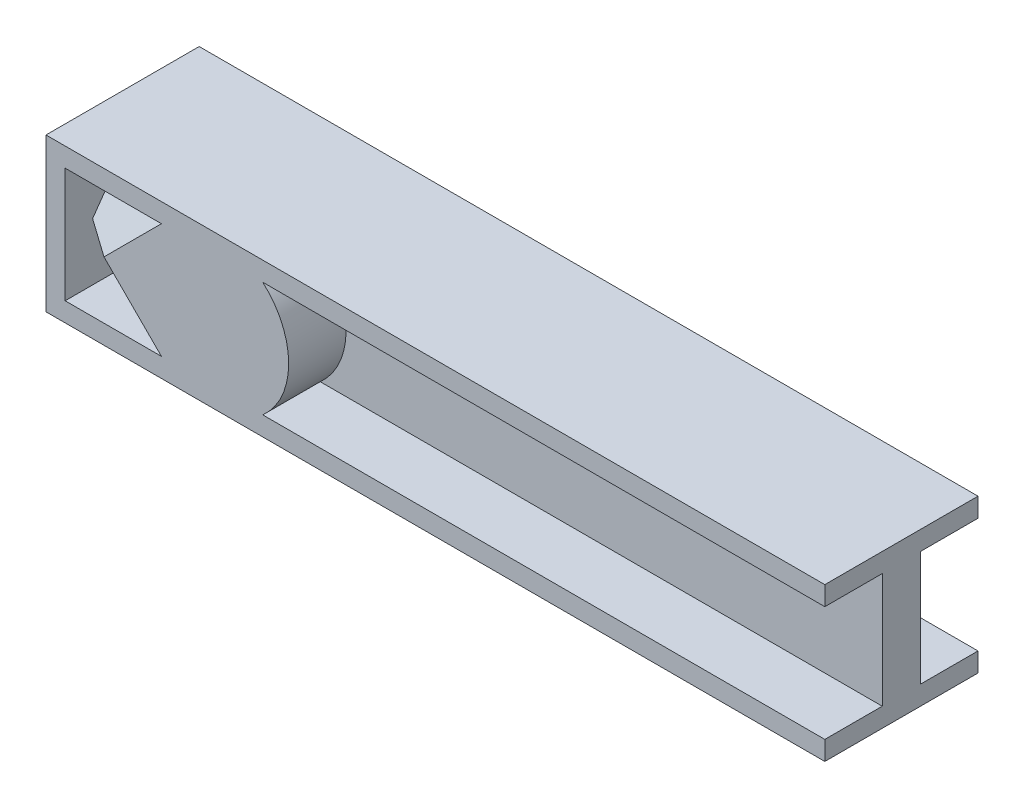
ISO-10303-21;
HEADER;
FILE_DESCRIPTION(('STEP AP214'),'2;1');
FILE_NAME('part.step','',(''),(''),'','','');
FILE_SCHEMA(('AUTOMOTIVE_DESIGN { 1 0 10303 214 1 1 1 1 }'));
ENDSEC;
DATA;
#1=APPLICATION_CONTEXT('core data for automotive mechanical design processes');
#2=APPLICATION_PROTOCOL_DEFINITION('international standard','automotive_design',2000,#1);
#3=PRODUCT_CONTEXT('',#1,'mechanical');
#4=PRODUCT('Part','Part','',(#3));
#5=PRODUCT_RELATED_PRODUCT_CATEGORY('part','',(#4));
#6=PRODUCT_DEFINITION_FORMATION('','',#4);
#7=PRODUCT_DEFINITION_CONTEXT('part definition',#1,'design');
#8=PRODUCT_DEFINITION('design','',#6,#7);
#9=PRODUCT_DEFINITION_SHAPE('','',#8);
#10=(LENGTH_UNIT() NAMED_UNIT(*) SI_UNIT(.MILLI.,.METRE.));
#11=(NAMED_UNIT(*) PLANE_ANGLE_UNIT() SI_UNIT($,.RADIAN.));
#12=(NAMED_UNIT(*) SI_UNIT($,.STERADIAN.) SOLID_ANGLE_UNIT());
#13=UNCERTAINTY_MEASURE_WITH_UNIT(LENGTH_MEASURE(1.E-05),#10,'distance_accuracy_value','');
#14=(GEOMETRIC_REPRESENTATION_CONTEXT(3) GLOBAL_UNCERTAINTY_ASSIGNED_CONTEXT((#13)) GLOBAL_UNIT_ASSIGNED_CONTEXT((#10,
#11,#12)) REPRESENTATION_CONTEXT('',''));
#15=CARTESIAN_POINT('',(0.,0.,0.));
#16=DIRECTION('',(0.,0.,1.));
#17=DIRECTION('',(1.,0.,0.));
#18=AXIS2_PLACEMENT_3D('',#15,#16,#17);
#19=CARTESIAN_POINT('',(0.,0.,2.5));
#20=DIRECTION('',(0.,0.,1.));
#21=DIRECTION('',(1.,0.,0.));
#22=AXIS2_PLACEMENT_3D('',#19,#20,#21);
#23=PLANE('',#22);
#24=DIRECTION('',(1.,0.,0.));
#25=VECTOR('',#24,1.);
#26=CARTESIAN_POINT('',(-59.1849756582735,-7.5,2.5));
#27=LINE('',#26,#25);
#28=CARTESIAN_POINT('',(-59.1849756582735,-7.5,2.5));
#29=VERTEX_POINT('',#28);
#30=CARTESIAN_POINT('',(-57.2209799954598,-7.5,2.5));
#31=VERTEX_POINT('',#30);
#32=EDGE_CURVE('E366',#29,#31,#27,.T.);
#33=ORIENTED_EDGE('',*,*,#32,.T.);
#34=DIRECTION('',(-0.70710678118654,0.707106781186555,0.));
#35=VECTOR('',#34,1.);
#36=CARTESIAN_POINT('',(-59.4176791365607,-5.303300858899,2.5));
#37=LINE('',#36,#35);
#38=CARTESIAN_POINT('',(-59.1849756582735,-5.53600433718624,2.5));
#39=VERTEX_POINT('',#38);
#40=EDGE_CURVE('E337',#31,#39,#37,.T.);
#41=ORIENTED_EDGE('',*,*,#40,.T.);
#42=DIRECTION('',(0.,-1.,0.));
#43=VECTOR('',#42,1.);
#44=CARTESIAN_POINT('',(-59.1849756582735,7.5,2.5));
#45=LINE('',#44,#43);
#46=EDGE_CURVE('E367',#39,#29,#45,.T.);
#47=ORIENTED_EDGE('',*,*,#46,.T.);
#48=EDGE_LOOP('',(#33,#41,#47));
#49=FACE_BOUND('',#48,.T.);
#50=ADVANCED_FACE('F35',(#49),#23,.T.);
#51=CARTESIAN_POINT('',(0.,0.,-2.5));
#52=DIRECTION('',(0.,0.,1.));
#53=DIRECTION('',(1.,0.,0.));
#54=AXIS2_PLACEMENT_3D('',#51,#52,#53);
#55=PLANE('',#54);
#56=DIRECTION('',(0.,-1.,0.));
#57=VECTOR('',#56,1.);
#58=CARTESIAN_POINT('',(-59.1849756582735,7.5,-2.5));
#59=LINE('',#58,#57);
#60=CARTESIAN_POINT('',(-59.1849756582735,-5.53600433718614,-2.5));
#61=VERTEX_POINT('',#60);
#62=CARTESIAN_POINT('',(-59.1849756582735,-7.5,-2.5));
#63=VERTEX_POINT('',#62);
#64=EDGE_CURVE('E196',#61,#63,#59,.T.);
#65=ORIENTED_EDGE('',*,*,#64,.F.);
#66=DIRECTION('',(0.70710678118654,-0.707106781186555,0.));
#67=VECTOR('',#66,1.);
#68=CARTESIAN_POINT('',(-32.3604899977304,-32.3604899977298,-2.5));
#69=LINE('',#68,#67);
#70=CARTESIAN_POINT('',(-57.2209799954597,-7.5,-2.5));
#71=VERTEX_POINT('',#70);
#72=EDGE_CURVE('E213',#61,#71,#69,.T.);
#73=ORIENTED_EDGE('',*,*,#72,.T.);
#74=DIRECTION('',(1.,0.,0.));
#75=VECTOR('',#74,1.);
#76=CARTESIAN_POINT('',(-59.1849756582735,-7.5,-2.5));
#77=LINE('',#76,#75);
#78=EDGE_CURVE('E211',#63,#71,#77,.T.);
#79=ORIENTED_EDGE('',*,*,#78,.F.);
#80=EDGE_LOOP('',(#65,#73,#79));
#81=FACE_BOUND('',#80,.T.);
#82=ADVANCED_FACE('F212',(#81),#55,.F.);
#83=CARTESIAN_POINT('',(-59.1849756582735,7.5,10.));
#84=DIRECTION('',(0.,-1.,0.));
#85=DIRECTION('',(0.,0.,-1.));
#86=AXIS2_PLACEMENT_3D('',#83,#84,#85);
#87=PLANE('',#86);
#88=DIRECTION('',(-1.,0.,0.));
#89=VECTOR('',#88,1.);
#90=CARTESIAN_POINT('',(-59.1849756582735,7.5,-10.));
#91=LINE('',#90,#89);
#92=CARTESIAN_POINT('',(-46.6143782776615,7.5,-10.));
#93=VERTEX_POINT('',#92);
#94=CARTESIAN_POINT('',(-59.1849756582735,7.5,-10.));
#95=VERTEX_POINT('',#94);
#96=EDGE_CURVE('E387',#93,#95,#91,.T.);
#97=ORIENTED_EDGE('',*,*,#96,.F.);
#98=DIRECTION('',(-0.816496580927726,0.,0.577350269189626));
#99=VECTOR('',#98,1.);
#100=CARTESIAN_POINT('',(-64.4228669472235,7.5,2.59250310093099));
#101=LINE('',#100,#99);
#102=CARTESIAN_POINT('',(-57.2209799954599,7.5,-2.5));
#103=VERTEX_POINT('',#102);
#104=EDGE_CURVE('E333',#93,#103,#101,.T.);
#105=ORIENTED_EDGE('',*,*,#104,.T.);
#106=DIRECTION('',(-1.,0.,0.));
#107=VECTOR('',#106,1.);
#108=CARTESIAN_POINT('',(-59.1849756582735,7.5,-2.5));
#109=LINE('',#108,#107);
#110=CARTESIAN_POINT('',(-59.1849756582735,7.5,-2.5));
#111=VERTEX_POINT('',#110);
#112=EDGE_CURVE('E216',#103,#111,#109,.T.);
#113=ORIENTED_EDGE('',*,*,#112,.T.);
#114=DIRECTION('',(0.,0.,-1.));
#115=VECTOR('',#114,1.);
#116=CARTESIAN_POINT('',(-59.1849756582735,7.5,10.));
#117=LINE('',#116,#115);
#118=EDGE_CURVE('E226',#111,#95,#117,.T.);
#119=ORIENTED_EDGE('',*,*,#118,.T.);
#120=EDGE_LOOP('',(#97,#105,#113,#119));
#121=FACE_BOUND('',#120,.T.);
#122=ADVANCED_FACE('F409',(#121),#87,.T.);
#123=CARTESIAN_POINT('',(-59.1849756582735,7.5,10.));
#124=DIRECTION('',(1.,0.,0.));
#125=DIRECTION('',(0.,0.,-1.));
#126=AXIS2_PLACEMENT_3D('',#123,#124,#125);
#127=PLANE('',#126);
#128=DIRECTION('',(0.,-0.816496580927721,-0.577350269189634));
#129=VECTOR('',#128,1.);
#130=CARTESIAN_POINT('',(-59.1849756582735,12.7378912889501,2.59250310093109));
#131=LINE('',#130,#129);
#132=CARTESIAN_POINT('',(-59.1849756582735,5.5360043371864,-2.5));
#133=VERTEX_POINT('',#132);
#134=CARTESIAN_POINT('',(-59.1849756582735,1.92554305833426E-13,-6.41454620750259));
#135=VERTEX_POINT('',#134);
#136=EDGE_CURVE('E325',#133,#135,#131,.T.);
#137=ORIENTED_EDGE('',*,*,#136,.T.);
#138=DIRECTION('',(0.,-0.816496580927726,0.577350269189626));
#139=VECTOR('',#138,1.);
#140=CARTESIAN_POINT('',(-59.1849756582735,-2.73789128894994,-4.47856471093438));
#141=LINE('',#140,#139);
#142=EDGE_CURVE('E204',#135,#61,#141,.T.);
#143=ORIENTED_EDGE('',*,*,#142,.T.);
#144=ORIENTED_EDGE('',*,*,#64,.T.);
#145=DIRECTION('',(0.,0.,-1.));
#146=VECTOR('',#145,1.);
#147=CARTESIAN_POINT('',(-59.1849756582735,-7.5,10.));
#148=LINE('',#147,#146);
#149=CARTESIAN_POINT('',(-59.1849756582735,-7.5,-10.));
#150=VERTEX_POINT('',#149);
#151=EDGE_CURVE('E201',#63,#150,#148,.T.);
#152=ORIENTED_EDGE('',*,*,#151,.T.);
#153=DIRECTION('',(0.,-1.,0.));
#154=VECTOR('',#153,1.);
#155=CARTESIAN_POINT('',(-59.1849756582735,7.5,-10.));
#156=LINE('',#155,#154);
#157=EDGE_CURVE('E389',#95,#150,#156,.T.);
#158=ORIENTED_EDGE('',*,*,#157,.F.);
#159=ORIENTED_EDGE('',*,*,#118,.F.);
#160=EDGE_CURVE('E207',#111,#133,#59,.T.);
#161=ORIENTED_EDGE('',*,*,#160,.T.);
#162=EDGE_LOOP('',(#137,#143,#144,#152,#158,#159,#161));
#163=FACE_BOUND('',#162,.T.);
#164=ADVANCED_FACE('F198',(#163),#127,.T.);
#165=CARTESIAN_POINT('',(-59.1849756582735,-7.5,10.));
#166=DIRECTION('',(0.,1.,0.));
#167=DIRECTION('',(0.,0.,1.));
#168=AXIS2_PLACEMENT_3D('',#165,#166,#167);
#169=PLANE('',#168);
#170=ORIENTED_EDGE('',*,*,#78,.T.);
#171=DIRECTION('',(0.816496580927721,0.,-0.577350269189634));
#172=VECTOR('',#171,1.);
#173=CARTESIAN_POINT('',(-64.4228669472235,-7.5,2.5925031009312));
#174=LINE('',#173,#172);
#175=CARTESIAN_POINT('',(-46.6143782776615,-7.5,-10.));
#176=VERTEX_POINT('',#175);
#177=EDGE_CURVE('E331',#71,#176,#174,.T.);
#178=ORIENTED_EDGE('',*,*,#177,.T.);
#179=DIRECTION('',(1.,0.,0.));
#180=VECTOR('',#179,1.);
#181=CARTESIAN_POINT('',(-59.1849756582735,-7.5,-10.));
#182=LINE('',#181,#180);
#183=EDGE_CURVE('E220',#150,#176,#182,.T.);
#184=ORIENTED_EDGE('',*,*,#183,.F.);
#185=ORIENTED_EDGE('',*,*,#151,.F.);
#186=EDGE_LOOP('',(#170,#178,#184,#185));
#187=FACE_BOUND('',#186,.T.);
#188=ADVANCED_FACE('F218',(#187),#169,.T.);
#189=CARTESIAN_POINT('',(0.,-7.5,0.));
#190=DIRECTION('',(0.,-1.,0.));
#191=DIRECTION('',(0.,0.,-1.));
#192=AXIS2_PLACEMENT_3D('',#189,#190,#191);
#193=PLANE('',#192);
#194=DIRECTION('',(0.,0.,-1.));
#195=VECTOR('',#194,1.);
#196=CARTESIAN_POINT('',(-33.3856217223385,-7.5,10.));
#197=LINE('',#196,#195);
#198=CARTESIAN_POINT('',(-33.3856217223385,-7.5,10.));
#199=VERTEX_POINT('',#198);
#200=CARTESIAN_POINT('',(-33.3856217223385,-7.5,2.50000000000002));
#201=VERTEX_POINT('',#200);
#202=EDGE_CURVE('E261',#199,#201,#197,.T.);
#203=ORIENTED_EDGE('',*,*,#202,.F.);
#204=DIRECTION('',(1.,0.,0.));
#205=VECTOR('',#204,1.);
#206=CARTESIAN_POINT('',(40.,-7.5,10.));
#207=LINE('',#206,#205);
#208=CARTESIAN_POINT('',(40.,-7.5,10.));
#209=VERTEX_POINT('',#208);
#210=EDGE_CURVE('E291',#199,#209,#207,.T.);
#211=ORIENTED_EDGE('',*,*,#210,.T.);
#212=DIRECTION('',(0.,0.,-1.));
#213=VECTOR('',#212,1.);
#214=CARTESIAN_POINT('',(40.,-7.5,2.49999999999998));
#215=LINE('',#214,#213);
#216=CARTESIAN_POINT('',(40.,-7.5,2.49999999999998));
#217=VERTEX_POINT('',#216);
#218=EDGE_CURVE('E284',#209,#217,#215,.T.);
#219=ORIENTED_EDGE('',*,*,#218,.T.);
#220=DIRECTION('',(-1.,0.,0.));
#221=VECTOR('',#220,1.);
#222=CARTESIAN_POINT('',(40.,-7.5,2.49999999999998));
#223=LINE('',#222,#221);
#224=EDGE_CURVE('E287',#217,#201,#223,.T.);
#225=ORIENTED_EDGE('',*,*,#224,.T.);
#226=EDGE_LOOP('',(#203,#211,#219,#225));
#227=FACE_BOUND('',#226,.T.);
#228=ADVANCED_FACE('F455',(#227),#193,.F.);
#229=CARTESIAN_POINT('',(0.,7.5,0.));
#230=DIRECTION('',(0.,-1.,0.));
#231=DIRECTION('',(0.,0.,-1.));
#232=AXIS2_PLACEMENT_3D('',#229,#230,#231);
#233=PLANE('',#232);
#234=DIRECTION('',(1.,0.,0.));
#235=VECTOR('',#234,1.);
#236=CARTESIAN_POINT('',(40.,7.5,10.));
#237=LINE('',#236,#235);
#238=CARTESIAN_POINT('',(-33.3856217223385,7.5,10.));
#239=VERTEX_POINT('',#238);
#240=CARTESIAN_POINT('',(40.,7.5,10.));
#241=VERTEX_POINT('',#240);
#242=EDGE_CURVE('E288',#239,#241,#237,.T.);
#243=ORIENTED_EDGE('',*,*,#242,.F.);
#244=DIRECTION('',(0.,0.,-1.));
#245=VECTOR('',#244,1.);
#246=CARTESIAN_POINT('',(-33.3856217223385,7.5,10.));
#247=LINE('',#246,#245);
#248=CARTESIAN_POINT('',(-33.3856217223385,7.5,2.49999999999998));
#249=VERTEX_POINT('',#248);
#250=EDGE_CURVE('E256',#239,#249,#247,.T.);
#251=ORIENTED_EDGE('',*,*,#250,.T.);
#252=DIRECTION('',(-1.,0.,0.));
#253=VECTOR('',#252,1.);
#254=CARTESIAN_POINT('',(40.,7.5,2.49999999999998));
#255=LINE('',#254,#253);
#256=CARTESIAN_POINT('',(40.,7.5,2.49999999999998));
#257=VERTEX_POINT('',#256);
#258=EDGE_CURVE('E295',#257,#249,#255,.T.);
#259=ORIENTED_EDGE('',*,*,#258,.F.);
#260=DIRECTION('',(0.,0.,-1.));
#261=VECTOR('',#260,1.);
#262=CARTESIAN_POINT('',(40.,7.5,2.49999999999998));
#263=LINE('',#262,#261);
#264=EDGE_CURVE('E263',#241,#257,#263,.T.);
#265=ORIENTED_EDGE('',*,*,#264,.F.);
#266=EDGE_LOOP('',(#243,#251,#259,#265));
#267=FACE_BOUND('',#266,.T.);
#268=ADVANCED_FACE('F445',(#267),#233,.T.);
#269=CARTESIAN_POINT('',(0.,-7.5,0.));
#270=DIRECTION('',(0.,-1.,0.));
#271=DIRECTION('',(0.,0.,-1.));
#272=AXIS2_PLACEMENT_3D('',#269,#270,#271);
#273=PLANE('',#272);
#274=DIRECTION('',(0.,0.,-1.));
#275=VECTOR('',#274,1.);
#276=CARTESIAN_POINT('',(-33.3856217223385,-7.5,10.));
#277=LINE('',#276,#275);
#278=CARTESIAN_POINT('',(-33.3856217223385,-7.5,-2.5));
#279=VERTEX_POINT('',#278);
#280=CARTESIAN_POINT('',(-33.3856217223385,-7.5,-10.));
#281=VERTEX_POINT('',#280);
#282=EDGE_CURVE('E254',#279,#281,#277,.T.);
#283=ORIENTED_EDGE('',*,*,#282,.F.);
#284=DIRECTION('',(1.,0.,0.));
#285=VECTOR('',#284,1.);
#286=CARTESIAN_POINT('',(-40.,-7.5,-2.5));
#287=LINE('',#286,#285);
#288=CARTESIAN_POINT('',(40.,-7.5,-2.5));
#289=VERTEX_POINT('',#288);
#290=EDGE_CURVE('E267',#279,#289,#287,.T.);
#291=ORIENTED_EDGE('',*,*,#290,.T.);
#292=DIRECTION('',(0.,0.,-1.));
#293=VECTOR('',#292,1.);
#294=CARTESIAN_POINT('',(40.,-7.5,-10.));
#295=LINE('',#294,#293);
#296=CARTESIAN_POINT('',(40.,-7.5,-10.));
#297=VERTEX_POINT('',#296);
#298=EDGE_CURVE('E270',#289,#297,#295,.T.);
#299=ORIENTED_EDGE('',*,*,#298,.T.);
#300=DIRECTION('',(-1.,0.,0.));
#301=VECTOR('',#300,1.);
#302=CARTESIAN_POINT('',(-40.,-7.5,-10.));
#303=LINE('',#302,#301);
#304=EDGE_CURVE('E264',#297,#281,#303,.T.);
#305=ORIENTED_EDGE('',*,*,#304,.T.);
#306=EDGE_LOOP('',(#283,#291,#299,#305));
#307=FACE_BOUND('',#306,.T.);
#308=ADVANCED_FACE('F441',(#307),#273,.F.);
#309=CARTESIAN_POINT('',(0.,7.5,0.));
#310=DIRECTION('',(0.,-1.,0.));
#311=DIRECTION('',(0.,0.,-1.));
#312=AXIS2_PLACEMENT_3D('',#309,#310,#311);
#313=PLANE('',#312);
#314=DIRECTION('',(1.,0.,0.));
#315=VECTOR('',#314,1.);
#316=CARTESIAN_POINT('',(-40.,7.5,-2.5));
#317=LINE('',#316,#315);
#318=CARTESIAN_POINT('',(-33.3856217223385,7.5,-2.5));
#319=VERTEX_POINT('',#318);
#320=CARTESIAN_POINT('',(40.,7.5,-2.5));
#321=VERTEX_POINT('',#320);
#322=EDGE_CURVE('E276',#319,#321,#317,.T.);
#323=ORIENTED_EDGE('',*,*,#322,.F.);
#324=DIRECTION('',(0.,0.,-1.));
#325=VECTOR('',#324,1.);
#326=CARTESIAN_POINT('',(-33.3856217223385,7.5,10.));
#327=LINE('',#326,#325);
#328=CARTESIAN_POINT('',(-33.3856217223385,7.5,-10.));
#329=VERTEX_POINT('',#328);
#330=EDGE_CURVE('E322',#319,#329,#327,.T.);
#331=ORIENTED_EDGE('',*,*,#330,.T.);
#332=DIRECTION('',(-1.,0.,0.));
#333=VECTOR('',#332,1.);
#334=CARTESIAN_POINT('',(-40.,7.5,-10.));
#335=LINE('',#334,#333);
#336=CARTESIAN_POINT('',(40.,7.5,-10.));
#337=VERTEX_POINT('',#336);
#338=EDGE_CURVE('E273',#337,#329,#335,.T.);
#339=ORIENTED_EDGE('',*,*,#338,.F.);
#340=DIRECTION('',(0.,0.,-1.));
#341=VECTOR('',#340,1.);
#342=CARTESIAN_POINT('',(40.,7.5,-10.));
#343=LINE('',#342,#341);
#344=EDGE_CURVE('E268',#321,#337,#343,.T.);
#345=ORIENTED_EDGE('',*,*,#344,.F.);
#346=EDGE_LOOP('',(#323,#331,#339,#345));
#347=FACE_BOUND('',#346,.T.);
#348=ADVANCED_FACE('F444',(#347),#313,.T.);
#349=CARTESIAN_POINT('',(-40.,10.,10.));
#350=DIRECTION('',(0.,0.,-1.));
#351=DIRECTION('',(-1.,0.,0.));
#352=AXIS2_PLACEMENT_3D('',#349,#350,#351);
#353=PLANE('',#352);
#354=ORIENTED_EDGE('',*,*,#210,.F.);
#355=CARTESIAN_POINT('',(-40.,0.,10.));
#356=DIRECTION('',(0.,0.,1.));
#357=DIRECTION('',(1.,0.,0.));
#358=AXIS2_PLACEMENT_3D('',#355,#356,#357);
#359=CIRCLE('',#358,10.);
#360=EDGE_CURVE('E236',#199,#239,#359,.T.);
#361=ORIENTED_EDGE('',*,*,#360,.T.);
#362=ORIENTED_EDGE('',*,*,#242,.T.);
#363=DIRECTION('',(0.,-1.,0.));
#364=VECTOR('',#363,1.);
#365=CARTESIAN_POINT('',(40.,10.,10.));
#366=LINE('',#365,#364);
#367=CARTESIAN_POINT('',(40.,10.,10.));
#368=VERTEX_POINT('',#367);
#369=EDGE_CURVE('E319',#368,#241,#366,.T.);
#370=ORIENTED_EDGE('',*,*,#369,.F.);
#371=DIRECTION('',(1.,0.,0.));
#372=VECTOR('',#371,1.);
#373=CARTESIAN_POINT('',(-40.,10.,10.));
#374=LINE('',#373,#372);
#375=CARTESIAN_POINT('',(-61.6849756582735,10.,10.));
#376=VERTEX_POINT('',#375);
#377=EDGE_CURVE('E300',#376,#368,#374,.T.);
#378=ORIENTED_EDGE('',*,*,#377,.F.);
#379=DIRECTION('',(0.,-1.,0.));
#380=VECTOR('',#379,1.);
#381=CARTESIAN_POINT('',(-61.6849756582735,10.,10.));
#382=LINE('',#381,#380);
#383=CARTESIAN_POINT('',(-61.6849756582735,-10.,10.));
#384=VERTEX_POINT('',#383);
#385=EDGE_CURVE('E239',#376,#384,#382,.T.);
#386=ORIENTED_EDGE('',*,*,#385,.T.);
#387=DIRECTION('',(1.,0.,0.));
#388=VECTOR('',#387,1.);
#389=CARTESIAN_POINT('',(-40.,-10.,10.));
#390=LINE('',#389,#388);
#391=CARTESIAN_POINT('',(40.,-10.,10.));
#392=VERTEX_POINT('',#391);
#393=EDGE_CURVE('E283',#384,#392,#390,.T.);
#394=ORIENTED_EDGE('',*,*,#393,.T.);
#395=EDGE_CURVE('E318',#209,#392,#366,.T.);
#396=ORIENTED_EDGE('',*,*,#395,.F.);
#397=EDGE_LOOP('',(#354,#361,#362,#370,#378,#386,#394,#396));
#398=FACE_BOUND('',#397,.T.);
#399=DIRECTION('',(0.707106781186554,0.707106781186541,0.));
#400=VECTOR('',#399,1.);
#401=CARTESIAN_POINT('',(-46.6143782776615,7.5,10.));
#402=LINE('',#401,#400);
#403=CARTESIAN_POINT('',(-54.1143782776615,1.4658413372004E-13,10.));
#404=VERTEX_POINT('',#403);
#405=CARTESIAN_POINT('',(-46.6143782776615,7.5,10.));
#406=VERTEX_POINT('',#405);
#407=EDGE_CURVE('E356',#404,#406,#402,.T.);
#408=ORIENTED_EDGE('',*,*,#407,.F.);
#409=DIRECTION('',(-0.70710678118654,0.707106781186555,0.));
#410=VECTOR('',#409,1.);
#411=CARTESIAN_POINT('',(-54.1143782776615,1.4658413372004E-13,10.));
#412=LINE('',#411,#410);
#413=CARTESIAN_POINT('',(-46.6143782776615,-7.5,10.));
#414=VERTEX_POINT('',#413);
#415=EDGE_CURVE('E351',#414,#404,#412,.T.);
#416=ORIENTED_EDGE('',*,*,#415,.F.);
#417=DIRECTION('',(1.,0.,0.));
#418=VECTOR('',#417,1.);
#419=CARTESIAN_POINT('',(-59.1849756582735,-7.5,10.));
#420=LINE('',#419,#418);
#421=CARTESIAN_POINT('',(-59.1849756582735,-7.5,10.));
#422=VERTEX_POINT('',#421);
#423=EDGE_CURVE('E223',#422,#414,#420,.T.);
#424=ORIENTED_EDGE('',*,*,#423,.F.);
#425=DIRECTION('',(0.,-1.,0.));
#426=VECTOR('',#425,1.);
#427=CARTESIAN_POINT('',(-59.1849756582735,7.5,10.));
#428=LINE('',#427,#426);
#429=CARTESIAN_POINT('',(-59.1849756582735,7.5,10.));
#430=VERTEX_POINT('',#429);
#431=EDGE_CURVE('E227',#430,#422,#428,.T.);
#432=ORIENTED_EDGE('',*,*,#431,.F.);
#433=DIRECTION('',(-1.,0.,0.));
#434=VECTOR('',#433,1.);
#435=CARTESIAN_POINT('',(-59.1849756582735,7.5,10.));
#436=LINE('',#435,#434);
#437=EDGE_CURVE('E378',#406,#430,#436,.T.);
#438=ORIENTED_EDGE('',*,*,#437,.F.);
#439=EDGE_LOOP('',(#408,#416,#424,#432,#438));
#440=FACE_BOUND('',#439,.T.);
#441=ADVANCED_FACE('F449',(#398,#440),#353,.F.);
#442=CARTESIAN_POINT('',(40.,10.,10.));
#443=DIRECTION('',(-1.,0.,0.));
#444=DIRECTION('',(0.,0.,1.));
#445=AXIS2_PLACEMENT_3D('',#442,#443,#444);
#446=PLANE('',#445);
#447=DIRECTION('',(0.,-1.,0.));
#448=VECTOR('',#447,1.);
#449=CARTESIAN_POINT('',(40.,10.,-10.));
#450=LINE('',#449,#448);
#451=CARTESIAN_POINT('',(40.,-10.,-10.));
#452=VERTEX_POINT('',#451);
#453=EDGE_CURVE('E308',#297,#452,#450,.T.);
#454=ORIENTED_EDGE('',*,*,#453,.F.);
#455=ORIENTED_EDGE('',*,*,#298,.F.);
#456=DIRECTION('',(0.,1.,0.));
#457=VECTOR('',#456,1.);
#458=CARTESIAN_POINT('',(40.,-7.5,-2.5));
#459=LINE('',#458,#457);
#460=EDGE_CURVE('E272',#289,#321,#459,.T.);
#461=ORIENTED_EDGE('',*,*,#460,.T.);
#462=ORIENTED_EDGE('',*,*,#344,.T.);
#463=CARTESIAN_POINT('',(40.,10.,-10.));
#464=VERTEX_POINT('',#463);
#465=EDGE_CURVE('E315',#464,#337,#450,.T.);
#466=ORIENTED_EDGE('',*,*,#465,.F.);
#467=DIRECTION('',(0.,0.,-1.));
#468=VECTOR('',#467,1.);
#469=CARTESIAN_POINT('',(40.,10.,10.));
#470=LINE('',#469,#468);
#471=EDGE_CURVE('E303',#368,#464,#470,.T.);
#472=ORIENTED_EDGE('',*,*,#471,.F.);
#473=ORIENTED_EDGE('',*,*,#369,.T.);
#474=ORIENTED_EDGE('',*,*,#264,.T.);
#475=DIRECTION('',(0.,1.,0.));
#476=VECTOR('',#475,1.);
#477=CARTESIAN_POINT('',(40.,-7.5,2.49999999999998));
#478=LINE('',#477,#476);
#479=EDGE_CURVE('E277',#217,#257,#478,.T.);
#480=ORIENTED_EDGE('',*,*,#479,.F.);
#481=ORIENTED_EDGE('',*,*,#218,.F.);
#482=ORIENTED_EDGE('',*,*,#395,.T.);
#483=DIRECTION('',(0.,0.,-1.));
#484=VECTOR('',#483,1.);
#485=CARTESIAN_POINT('',(40.,-10.,10.));
#486=LINE('',#485,#484);
#487=EDGE_CURVE('E311',#392,#452,#486,.T.);
#488=ORIENTED_EDGE('',*,*,#487,.T.);
#489=EDGE_LOOP('',(#454,#455,#461,#462,#466,#472,#473,#474,#480,#481,#482,#488));
#490=FACE_BOUND('',#489,.T.);
#491=ADVANCED_FACE('F475',(#490),#446,.F.);
#492=CARTESIAN_POINT('',(-40.,10.,-10.));
#493=DIRECTION('',(0.,0.,1.));
#494=DIRECTION('',(1.,0.,0.));
#495=AXIS2_PLACEMENT_3D('',#492,#493,#494);
#496=PLANE('',#495);
#497=DIRECTION('',(-1.,0.,0.));
#498=VECTOR('',#497,1.);
#499=CARTESIAN_POINT('',(-40.,-10.,-10.));
#500=LINE('',#499,#498);
#501=CARTESIAN_POINT('',(-61.6849756582735,-10.,-10.));
#502=VERTEX_POINT('',#501);
#503=EDGE_CURVE('E304',#452,#502,#500,.T.);
#504=ORIENTED_EDGE('',*,*,#503,.T.);
#505=DIRECTION('',(0.,-1.,0.));
#506=VECTOR('',#505,1.);
#507=CARTESIAN_POINT('',(-61.6849756582735,10.,-10.));
#508=LINE('',#507,#506);
#509=CARTESIAN_POINT('',(-61.6849756582735,10.,-10.));
#510=VERTEX_POINT('',#509);
#511=EDGE_CURVE('E240',#510,#502,#508,.T.);
#512=ORIENTED_EDGE('',*,*,#511,.F.);
#513=DIRECTION('',(-1.,0.,0.));
#514=VECTOR('',#513,1.);
#515=CARTESIAN_POINT('',(-40.,10.,-10.));
#516=LINE('',#515,#514);
#517=EDGE_CURVE('E306',#464,#510,#516,.T.);
#518=ORIENTED_EDGE('',*,*,#517,.F.);
#519=ORIENTED_EDGE('',*,*,#465,.T.);
#520=ORIENTED_EDGE('',*,*,#338,.T.);
#521=CARTESIAN_POINT('',(-40.,0.,-10.));
#522=DIRECTION('',(0.,0.,1.));
#523=DIRECTION('',(1.,0.,0.));
#524=AXIS2_PLACEMENT_3D('',#521,#522,#523);
#525=CIRCLE('',#524,10.);
#526=EDGE_CURVE('E235',#281,#329,#525,.T.);
#527=ORIENTED_EDGE('',*,*,#526,.F.);
#528=ORIENTED_EDGE('',*,*,#304,.F.);
#529=ORIENTED_EDGE('',*,*,#453,.T.);
#530=EDGE_LOOP('',(#504,#512,#518,#519,#520,#527,#528,#529));
#531=FACE_BOUND('',#530,.T.);
#532=DIRECTION('',(-0.70710678118654,0.707106781186555,0.));
#533=VECTOR('',#532,1.);
#534=CARTESIAN_POINT('',(-54.1143782776615,1.4658413372004E-13,-10.));
#535=LINE('',#534,#533);
#536=CARTESIAN_POINT('',(-54.1143782776615,1.4658413372004E-13,-10.));
#537=VERTEX_POINT('',#536);
#538=EDGE_CURVE('E372',#176,#537,#535,.T.);
#539=ORIENTED_EDGE('',*,*,#538,.T.);
#540=DIRECTION('',(0.707106781186554,0.707106781186541,0.));
#541=VECTOR('',#540,1.);
#542=CARTESIAN_POINT('',(-46.6143782776615,7.5,-10.));
#543=LINE('',#542,#541);
#544=EDGE_CURVE('E384',#537,#93,#543,.T.);
#545=ORIENTED_EDGE('',*,*,#544,.T.);
#546=ORIENTED_EDGE('',*,*,#96,.T.);
#547=ORIENTED_EDGE('',*,*,#157,.T.);
#548=ORIENTED_EDGE('',*,*,#183,.T.);
#549=EDGE_LOOP('',(#539,#545,#546,#547,#548));
#550=FACE_BOUND('',#549,.T.);
#551=ADVANCED_FACE('F391',(#531,#550),#496,.F.);
#552=CARTESIAN_POINT('',(0.,10.,0.));
#553=DIRECTION('',(0.,1.,0.));
#554=DIRECTION('',(0.,0.,1.));
#555=AXIS2_PLACEMENT_3D('',#552,#553,#554);
#556=PLANE('',#555);
#557=ORIENTED_EDGE('',*,*,#377,.T.);
#558=ORIENTED_EDGE('',*,*,#471,.T.);
#559=ORIENTED_EDGE('',*,*,#517,.T.);
#560=DIRECTION('',(0.,0.,-1.));
#561=VECTOR('',#560,1.);
#562=CARTESIAN_POINT('',(-61.6849756582735,10.,10.));
#563=LINE('',#562,#561);
#564=EDGE_CURVE('E249',#376,#510,#563,.T.);
#565=ORIENTED_EDGE('',*,*,#564,.F.);
#566=EDGE_LOOP('',(#557,#558,#559,#565));
#567=FACE_BOUND('',#566,.T.);
#568=ADVANCED_FACE('F466',(#567),#556,.T.);
#569=CARTESIAN_POINT('',(0.,-10.,0.));
#570=DIRECTION('',(0.,1.,0.));
#571=DIRECTION('',(0.,0.,1.));
#572=AXIS2_PLACEMENT_3D('',#569,#570,#571);
#573=PLANE('',#572);
#574=ORIENTED_EDGE('',*,*,#393,.F.);
#575=DIRECTION('',(0.,0.,-1.));
#576=VECTOR('',#575,1.);
#577=CARTESIAN_POINT('',(-61.6849756582735,-10.,10.));
#578=LINE('',#577,#576);
#579=EDGE_CURVE('E243',#384,#502,#578,.T.);
#580=ORIENTED_EDGE('',*,*,#579,.T.);
#581=ORIENTED_EDGE('',*,*,#503,.F.);
#582=ORIENTED_EDGE('',*,*,#487,.F.);
#583=EDGE_LOOP('',(#574,#580,#581,#582));
#584=FACE_BOUND('',#583,.T.);
#585=ADVANCED_FACE('F464',(#584),#573,.F.);
#586=CARTESIAN_POINT('',(40.,-7.5,2.49999999999998));
#587=DIRECTION('',(0.,0.,-1.));
#588=DIRECTION('',(-1.,0.,0.));
#589=AXIS2_PLACEMENT_3D('',#586,#587,#588);
#590=PLANE('',#589);
#591=CARTESIAN_POINT('',(-40.,0.,2.50000000000002));
#592=DIRECTION('',(0.,0.,-1.));
#593=DIRECTION('',(-1.,0.,0.));
#594=AXIS2_PLACEMENT_3D('',#591,#592,#593);
#595=CIRCLE('',#594,10.);
#596=EDGE_CURVE('E259',#201,#249,#595,.F.);
#597=ORIENTED_EDGE('',*,*,#596,.F.);
#598=ORIENTED_EDGE('',*,*,#224,.F.);
#599=ORIENTED_EDGE('',*,*,#479,.T.);
#600=ORIENTED_EDGE('',*,*,#258,.T.);
#601=EDGE_LOOP('',(#597,#598,#599,#600));
#602=FACE_BOUND('',#601,.T.);
#603=ADVANCED_FACE('F453',(#602),#590,.F.);
#604=CARTESIAN_POINT('',(-40.,-7.5,-2.5));
#605=DIRECTION('',(0.,0.,1.));
#606=DIRECTION('',(1.,0.,0.));
#607=AXIS2_PLACEMENT_3D('',#604,#605,#606);
#608=PLANE('',#607);
#609=CARTESIAN_POINT('',(-40.,0.,-2.5));
#610=DIRECTION('',(0.,0.,1.));
#611=DIRECTION('',(1.,0.,0.));
#612=AXIS2_PLACEMENT_3D('',#609,#610,#611);
#613=CIRCLE('',#612,10.);
#614=EDGE_CURVE('E252',#319,#279,#613,.F.);
#615=ORIENTED_EDGE('',*,*,#614,.F.);
#616=ORIENTED_EDGE('',*,*,#322,.T.);
#617=ORIENTED_EDGE('',*,*,#460,.F.);
#618=ORIENTED_EDGE('',*,*,#290,.F.);
#619=EDGE_LOOP('',(#615,#616,#617,#618));
#620=FACE_BOUND('',#619,.T.);
#621=ADVANCED_FACE('F439',(#620),#608,.F.);
#622=CARTESIAN_POINT('',(-40.,0.,10.));
#623=DIRECTION('',(0.,0.,-1.));
#624=DIRECTION('',(-1.,0.,0.));
#625=AXIS2_PLACEMENT_3D('',#622,#623,#624);
#626=CYLINDRICAL_SURFACE('',#625,10.);
#627=ORIENTED_EDGE('',*,*,#360,.F.);
#628=ORIENTED_EDGE('',*,*,#202,.T.);
#629=ORIENTED_EDGE('',*,*,#596,.T.);
#630=ORIENTED_EDGE('',*,*,#250,.F.);
#631=EDGE_LOOP('',(#627,#628,#629,#630));
#632=FACE_BOUND('',#631,.T.);
#633=ADVANCED_FACE('F436',(#632),#626,.T.);
#634=ORIENTED_EDGE('',*,*,#614,.T.);
#635=ORIENTED_EDGE('',*,*,#282,.T.);
#636=ORIENTED_EDGE('',*,*,#526,.T.);
#637=ORIENTED_EDGE('',*,*,#330,.F.);
#638=EDGE_LOOP('',(#634,#635,#636,#637));
#639=FACE_BOUND('',#638,.T.);
#640=ADVANCED_FACE('F434',(#639),#626,.T.);
#641=CARTESIAN_POINT('',(-61.6849756582735,10.,10.));
#642=DIRECTION('',(1.,0.,0.));
#643=DIRECTION('',(0.,0.,-1.));
#644=AXIS2_PLACEMENT_3D('',#641,#642,#643);
#645=PLANE('',#644);
#646=ORIENTED_EDGE('',*,*,#511,.T.);
#647=ORIENTED_EDGE('',*,*,#579,.F.);
#648=ORIENTED_EDGE('',*,*,#385,.F.);
#649=ORIENTED_EDGE('',*,*,#564,.T.);
#650=EDGE_LOOP('',(#646,#647,#648,#649));
#651=FACE_BOUND('',#650,.T.);
#652=ADVANCED_FACE('F430',(#651),#645,.F.);
#653=DIRECTION('',(-1.,0.,0.));
#654=VECTOR('',#653,1.);
#655=CARTESIAN_POINT('',(-59.1849756582735,7.5,2.5));
#656=LINE('',#655,#654);
#657=CARTESIAN_POINT('',(-57.22097999546,7.5,2.5));
#658=VERTEX_POINT('',#657);
#659=CARTESIAN_POINT('',(-59.1849756582735,7.5,2.5));
#660=VERTEX_POINT('',#659);
#661=EDGE_CURVE('E365',#658,#660,#656,.T.);
#662=ORIENTED_EDGE('',*,*,#661,.F.);
#663=DIRECTION('',(-0.816496580927733,0.,-0.577350269189616));
#664=VECTOR('',#663,1.);
#665=CARTESIAN_POINT('',(-54.994776531403,7.5,4.07416356573565));
#666=LINE('',#665,#664);
#667=EDGE_CURVE('E11',#658,#406,#666,.F.);
#668=ORIENTED_EDGE('',*,*,#667,.T.);
#669=ORIENTED_EDGE('',*,*,#437,.T.);
#670=EDGE_CURVE('E232',#430,#660,#117,.T.);
#671=ORIENTED_EDGE('',*,*,#670,.T.);
#672=EDGE_LOOP('',(#662,#668,#669,#671));
#673=FACE_BOUND('',#672,.T.);
#674=ADVANCED_FACE('F427',(#673),#87,.T.);
#675=ORIENTED_EDGE('',*,*,#46,.F.);
#676=DIRECTION('',(0.,-0.816496580927734,-0.577350269189615));
#677=VECTOR('',#676,1.);
#678=CARTESIAN_POINT('',(-59.1849756582735,6.69019912687078,11.1452313776009));
#679=LINE('',#678,#677);
#680=CARTESIAN_POINT('',(-59.1849756582735,1.98625837999344E-13,6.41454620750256));
#681=VERTEX_POINT('',#680);
#682=EDGE_CURVE('E52',#39,#681,#679,.F.);
#683=ORIENTED_EDGE('',*,*,#682,.T.);
#684=DIRECTION('',(0.,-0.816496580927728,0.577350269189623));
#685=VECTOR('',#684,1.);
#686=CARTESIAN_POINT('',(-59.1849756582735,3.30980087312945,4.07416356573573));
#687=LINE('',#686,#685);
#688=CARTESIAN_POINT('',(-59.1849756582735,5.53600433718652,2.5));
#689=VERTEX_POINT('',#688);
#690=EDGE_CURVE('E339',#681,#689,#687,.F.);
#691=ORIENTED_EDGE('',*,*,#690,.T.);
#692=EDGE_CURVE('E361',#660,#689,#45,.T.);
#693=ORIENTED_EDGE('',*,*,#692,.F.);
#694=ORIENTED_EDGE('',*,*,#670,.F.);
#695=ORIENTED_EDGE('',*,*,#431,.T.);
#696=EDGE_CURVE('E222',#422,#29,#148,.T.);
#697=ORIENTED_EDGE('',*,*,#696,.T.);
#698=EDGE_LOOP('',(#675,#683,#691,#693,#694,#695,#697));
#699=FACE_BOUND('',#698,.T.);
#700=ADVANCED_FACE('F359',(#699),#127,.T.);
#701=ORIENTED_EDGE('',*,*,#423,.T.);
#702=DIRECTION('',(0.816496580927728,0.,0.577350269189623));
#703=VECTOR('',#702,1.);
#704=CARTESIAN_POINT('',(-54.9947765314029,-7.5,4.07416356573561));
#705=LINE('',#704,#703);
#706=EDGE_CURVE('E44',#414,#31,#705,.F.);
#707=ORIENTED_EDGE('',*,*,#706,.T.);
#708=ORIENTED_EDGE('',*,*,#32,.F.);
#709=ORIENTED_EDGE('',*,*,#696,.F.);
#710=EDGE_LOOP('',(#701,#707,#708,#709));
#711=FACE_BOUND('',#710,.T.);
#712=ADVANCED_FACE('F416',(#711),#169,.T.);
#713=ORIENTED_EDGE('',*,*,#112,.F.);
#714=DIRECTION('',(-0.707106781186554,-0.707106781186541,0.));
#715=VECTOR('',#714,1.);
#716=CARTESIAN_POINT('',(-32.3604899977294,32.36048999773,-2.5));
#717=LINE('',#716,#715);
#718=EDGE_CURVE('E328',#103,#133,#717,.T.);
#719=ORIENTED_EDGE('',*,*,#718,.T.);
#720=ORIENTED_EDGE('',*,*,#160,.F.);
#721=EDGE_LOOP('',(#713,#719,#720));
#722=FACE_BOUND('',#721,.T.);
#723=ADVANCED_FACE('F411',(#722),#55,.F.);
#724=ORIENTED_EDGE('',*,*,#692,.T.);
#725=DIRECTION('',(0.707106781186554,0.707106781186541,0.));
#726=VECTOR('',#725,1.);
#727=CARTESIAN_POINT('',(-51.9176791365606,12.8033008588992,2.5));
#728=LINE('',#727,#726);
#729=EDGE_CURVE('E335',#689,#658,#728,.T.);
#730=ORIENTED_EDGE('',*,*,#729,.T.);
#731=ORIENTED_EDGE('',*,*,#661,.T.);
#732=EDGE_LOOP('',(#724,#730,#731));
#733=FACE_BOUND('',#732,.T.);
#734=ADVANCED_FACE('F363',(#733),#23,.T.);
#735=CARTESIAN_POINT('',(-46.6143782776615,7.5,-10.0000000000001));
#736=DIRECTION('',(0.499999999999998,-0.500000000000007,0.707106781186544));
#737=DIRECTION('',(0.707106781186554,0.707106781186541,0.));
#738=AXIS2_PLACEMENT_3D('',#735,#736,#737);
#739=PLANE('',#738);
#740=ORIENTED_EDGE('',*,*,#104,.F.);
#741=ORIENTED_EDGE('',*,*,#544,.F.);
#742=DIRECTION('',(0.816496580927723,0.,-0.57735026918963));
#743=VECTOR('',#742,1.);
#744=CARTESIAN_POINT('',(-54.1143782776615,1.4658413372004E-13,-10.0000000000001));
#745=LINE('',#744,#743);
#746=EDGE_CURVE('E208',#135,#537,#745,.T.);
#747=ORIENTED_EDGE('',*,*,#746,.F.);
#748=ORIENTED_EDGE('',*,*,#136,.F.);
#749=ORIENTED_EDGE('',*,*,#718,.F.);
#750=EDGE_LOOP('',(#740,#741,#747,#748,#749));
#751=FACE_BOUND('',#750,.T.);
#752=ADVANCED_FACE('F394',(#751),#739,.F.);
#753=CARTESIAN_POINT('',(-54.1143782776615,1.4658413372004E-13,-10.0000000000001));
#754=DIRECTION('',(0.500000000000008,0.499999999999997,0.707106781186544));
#755=DIRECTION('',(-0.70710678118654,0.707106781186555,0.));
#756=AXIS2_PLACEMENT_3D('',#753,#754,#755);
#757=PLANE('',#756);
#758=ORIENTED_EDGE('',*,*,#177,.F.);
#759=ORIENTED_EDGE('',*,*,#72,.F.);
#760=ORIENTED_EDGE('',*,*,#142,.F.);
#761=ORIENTED_EDGE('',*,*,#746,.T.);
#762=ORIENTED_EDGE('',*,*,#538,.F.);
#763=EDGE_LOOP('',(#758,#759,#760,#761,#762));
#764=FACE_BOUND('',#763,.T.);
#765=ADVANCED_FACE('F392',(#764),#757,.F.);
#766=CARTESIAN_POINT('',(-32.3604899977294,32.3604899977301,2.5));
#767=DIRECTION('',(-0.499999999999991,0.5,0.707106781186554));
#768=DIRECTION('',(-0.707106781186554,-0.707106781186541,0.));
#769=AXIS2_PLACEMENT_3D('',#766,#767,#768);
#770=PLANE('',#769);
#771=ORIENTED_EDGE('',*,*,#729,.F.);
#772=ORIENTED_EDGE('',*,*,#690,.F.);
#773=DIRECTION('',(-0.816496580927731,0.,-0.577350269189619));
#774=VECTOR('',#773,1.);
#775=CARTESIAN_POINT('',(-43.1473199969731,0.,17.7548812799427));
#776=LINE('',#775,#774);
#777=EDGE_CURVE('E39',#404,#681,#776,.T.);
#778=ORIENTED_EDGE('',*,*,#777,.F.);
#779=ORIENTED_EDGE('',*,*,#407,.T.);
#780=ORIENTED_EDGE('',*,*,#667,.F.);
#781=EDGE_LOOP('',(#771,#772,#778,#779,#780));
#782=FACE_BOUND('',#781,.T.);
#783=ADVANCED_FACE('F37',(#782),#770,.T.);
#784=CARTESIAN_POINT('',(-32.3604899977305,-32.3604899977298,2.5));
#785=DIRECTION('',(-0.500000000000001,-0.499999999999991,0.707106781186554));
#786=DIRECTION('',(0.70710678118654,-0.707106781186555,0.));
#787=AXIS2_PLACEMENT_3D('',#784,#785,#786);
#788=PLANE('',#787);
#789=ORIENTED_EDGE('',*,*,#706,.F.);
#790=ORIENTED_EDGE('',*,*,#415,.T.);
#791=ORIENTED_EDGE('',*,*,#777,.T.);
#792=ORIENTED_EDGE('',*,*,#682,.F.);
#793=ORIENTED_EDGE('',*,*,#40,.F.);
#794=EDGE_LOOP('',(#789,#790,#791,#792,#793));
#795=FACE_BOUND('',#794,.T.);
#796=ADVANCED_FACE('F349',(#795),#788,.T.);
#797=CLOSED_SHELL('',(#50,#82,#122,#164,#188,#228,#268,#308,#348,#441,#491,#551,#568,#585,#603,
#621,#633,#640,#652,#674,#700,#712,#723,#734,#752,#765,#783,#796));
#798=MANIFOLD_SOLID_BREP('B2',#797);
#799=ADVANCED_BREP_SHAPE_REPRESENTATION('',(#18,#798),#14);
#800=SHAPE_DEFINITION_REPRESENTATION(#9,#799);
ENDSEC;
END-ISO-10303-21;
